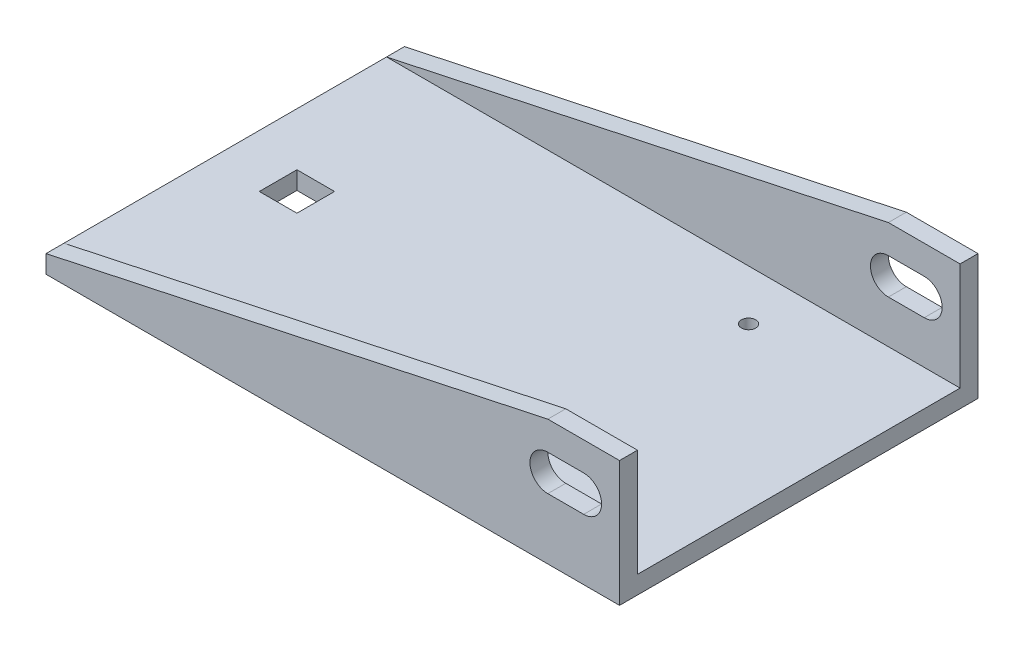
ISO-10303-21;
HEADER;
FILE_DESCRIPTION(('STEP AP214'),'2;1');
FILE_NAME('part.step','',(''),(''),'','','');
FILE_SCHEMA(('AUTOMOTIVE_DESIGN { 1 0 10303 214 1 1 1 1 }'));
ENDSEC;
DATA;
#1=APPLICATION_CONTEXT('core data for automotive mechanical design processes');
#2=APPLICATION_PROTOCOL_DEFINITION('international standard','automotive_design',2000,#1);
#3=PRODUCT_CONTEXT('',#1,'mechanical');
#4=PRODUCT('Part','Part','',(#3));
#5=PRODUCT_RELATED_PRODUCT_CATEGORY('part','',(#4));
#6=PRODUCT_DEFINITION_FORMATION('','',#4);
#7=PRODUCT_DEFINITION_CONTEXT('part definition',#1,'design');
#8=PRODUCT_DEFINITION('design','',#6,#7);
#9=PRODUCT_DEFINITION_SHAPE('','',#8);
#10=(LENGTH_UNIT() NAMED_UNIT(*) SI_UNIT(.MILLI.,.METRE.));
#11=(NAMED_UNIT(*) PLANE_ANGLE_UNIT() SI_UNIT($,.RADIAN.));
#12=(NAMED_UNIT(*) SI_UNIT($,.STERADIAN.) SOLID_ANGLE_UNIT());
#13=UNCERTAINTY_MEASURE_WITH_UNIT(LENGTH_MEASURE(1.E-05),#10,'distance_accuracy_value','');
#14=(GEOMETRIC_REPRESENTATION_CONTEXT(3) GLOBAL_UNCERTAINTY_ASSIGNED_CONTEXT((#13)) GLOBAL_UNIT_ASSIGNED_CONTEXT((#10,
#11,#12)) REPRESENTATION_CONTEXT('',''));
#15=CARTESIAN_POINT('',(0.,0.,0.));
#16=DIRECTION('',(0.,0.,1.));
#17=DIRECTION('',(1.,0.,0.));
#18=AXIS2_PLACEMENT_3D('',#15,#16,#17);
#19=CARTESIAN_POINT('',(0.,5.00000000000001,-100.));
#20=DIRECTION('',(0.209529088730874,-0.977802414077409,0.));
#21=DIRECTION('',(0.977802414077409,0.209529088730874,0.));
#22=AXIS2_PLACEMENT_3D('',#19,#20,#21);
#23=PLANE('',#22);
#24=DIRECTION('',(0.977802414077409,0.209529088730874,0.));
#25=VECTOR('',#24,1.);
#26=CARTESIAN_POINT('',(0.,5.00000000000001,-4.99999999999998));
#27=LINE('',#26,#25);
#28=CARTESIAN_POINT('',(-3.31657444563316E-13,4.99999999999995,-4.99999999999997));
#29=VERTEX_POINT('',#28);
#30=CARTESIAN_POINT('',(140.,35.,-4.99999999999996));
#31=VERTEX_POINT('',#30);
#32=EDGE_CURVE('E458',#29,#31,#27,.T.);
#33=ORIENTED_EDGE('',*,*,#32,.F.);
#34=DIRECTION('',(0.,0.,-1.));
#35=VECTOR('',#34,1.);
#36=CARTESIAN_POINT('',(0.,4.99999999999995,-50.));
#37=LINE('',#36,#35);
#38=CARTESIAN_POINT('',(0.,5.,0.));
#39=VERTEX_POINT('',#38);
#40=EDGE_CURVE('E460',#29,#39,#37,.F.);
#41=ORIENTED_EDGE('',*,*,#40,.T.);
#42=DIRECTION('',(-0.97780241407741,-0.209529088730873,0.));
#43=VECTOR('',#42,1.);
#44=CARTESIAN_POINT('',(140.,35.,0.));
#45=LINE('',#44,#43);
#46=CARTESIAN_POINT('',(140.,35.,0.));
#47=VERTEX_POINT('',#46);
#48=EDGE_CURVE('E471',#47,#39,#45,.T.);
#49=ORIENTED_EDGE('',*,*,#48,.F.);
#50=DIRECTION('',(0.,0.,1.));
#51=VECTOR('',#50,1.);
#52=CARTESIAN_POINT('',(140.,35.,-2.99999999999996));
#53=LINE('',#52,#51);
#54=EDGE_CURVE('E462',#31,#47,#53,.T.);
#55=ORIENTED_EDGE('',*,*,#54,.F.);
#56=EDGE_LOOP('',(#33,#41,#49,#55));
#57=FACE_BOUND('',#56,.T.);
#58=ADVANCED_FACE('F52',(#57),#23,.F.);
#59=CARTESIAN_POINT('',(0.,5.00000000000002,-100.));
#60=VERTEX_POINT('',#59);
#61=CARTESIAN_POINT('',(-3.3133218391157E-13,4.99999999999999,-95.));
#62=VERTEX_POINT('',#61);
#63=EDGE_CURVE('E344',#60,#62,#37,.F.);
#64=ORIENTED_EDGE('',*,*,#63,.T.);
#65=DIRECTION('',(-0.977802414077409,-0.209529088730874,0.));
#66=VECTOR('',#65,1.);
#67=CARTESIAN_POINT('',(0.,5.00000000000001,-95.));
#68=LINE('',#67,#66);
#69=CARTESIAN_POINT('',(140.,35.,-95.));
#70=VERTEX_POINT('',#69);
#71=EDGE_CURVE('E463',#70,#62,#68,.T.);
#72=ORIENTED_EDGE('',*,*,#71,.F.);
#73=DIRECTION('',(0.,0.,1.));
#74=VECTOR('',#73,1.);
#75=CARTESIAN_POINT('',(140.,35.,-100.));
#76=LINE('',#75,#74);
#77=CARTESIAN_POINT('',(140.,35.,-100.));
#78=VERTEX_POINT('',#77);
#79=EDGE_CURVE('E476',#78,#70,#76,.T.);
#80=ORIENTED_EDGE('',*,*,#79,.F.);
#81=DIRECTION('',(0.97780241407741,0.209529088730873,0.));
#82=VECTOR('',#81,1.);
#83=CARTESIAN_POINT('',(0.,5.00000000000002,-100.));
#84=LINE('',#83,#82);
#85=EDGE_CURVE('E382',#60,#78,#84,.T.);
#86=ORIENTED_EDGE('',*,*,#85,.F.);
#87=EDGE_LOOP('',(#64,#72,#80,#86));
#88=FACE_BOUND('',#87,.T.);
#89=ADVANCED_FACE('F275',(#88),#23,.F.);
#90=CARTESIAN_POINT('',(0.,33.,-95.));
#91=DIRECTION('',(0.,0.,1.));
#92=DIRECTION('',(0.,-1.,0.));
#93=AXIS2_PLACEMENT_3D('',#90,#91,#92);
#94=PLANE('',#93);
#95=ORIENTED_EDGE('',*,*,#71,.T.);
#96=DIRECTION('',(-1.,0.,0.));
#97=VECTOR('',#96,1.);
#98=CARTESIAN_POINT('',(0.,5.00000000000002,-95.));
#99=LINE('',#98,#97);
#100=CARTESIAN_POINT('',(160.,5.00000000000002,-95.));
#101=VERTEX_POINT('',#100);
#102=EDGE_CURVE('E178',#101,#62,#99,.T.);
#103=ORIENTED_EDGE('',*,*,#102,.F.);
#104=DIRECTION('',(0.,-1.,0.));
#105=VECTOR('',#104,1.);
#106=CARTESIAN_POINT('',(160.,8.12576687116561,-95.));
#107=LINE('',#106,#105);
#108=CARTESIAN_POINT('',(160.,35.,-95.));
#109=VERTEX_POINT('',#108);
#110=EDGE_CURVE('E191',#109,#101,#107,.T.);
#111=ORIENTED_EDGE('',*,*,#110,.F.);
#112=DIRECTION('',(-1.,0.,0.));
#113=VECTOR('',#112,1.);
#114=CARTESIAN_POINT('',(0.,35.,-95.));
#115=LINE('',#114,#113);
#116=EDGE_CURVE('E381',#109,#70,#115,.T.);
#117=ORIENTED_EDGE('',*,*,#116,.T.);
#118=EDGE_LOOP('',(#95,#103,#111,#117));
#119=FACE_BOUND('',#118,.T.);
#120=DIRECTION('',(1.,0.,0.));
#121=VECTOR('',#120,1.);
#122=CARTESIAN_POINT('',(150.,27.0000000000001,-95.));
#123=LINE('',#122,#121);
#124=CARTESIAN_POINT('',(140.,27.0000000000001,-95.));
#125=VERTEX_POINT('',#124);
#126=CARTESIAN_POINT('',(150.,27.0000000000001,-95.));
#127=VERTEX_POINT('',#126);
#128=EDGE_CURVE('E233',#125,#127,#123,.T.);
#129=ORIENTED_EDGE('',*,*,#128,.T.);
#130=CARTESIAN_POINT('',(150.,22.0000000000001,-95.));
#131=DIRECTION('',(0.,0.,1.));
#132=DIRECTION('',(0.,-1.,0.));
#133=AXIS2_PLACEMENT_3D('',#130,#131,#132);
#134=CIRCLE('',#133,5.);
#135=CARTESIAN_POINT('',(150.,17.0000000000001,-95.));
#136=VERTEX_POINT('',#135);
#137=EDGE_CURVE('E230',#127,#136,#134,.F.);
#138=ORIENTED_EDGE('',*,*,#137,.T.);
#139=DIRECTION('',(-1.,0.,0.));
#140=VECTOR('',#139,1.);
#141=CARTESIAN_POINT('',(150.,17.0000000000001,-95.));
#142=LINE('',#141,#140);
#143=CARTESIAN_POINT('',(140.,17.0000000000001,-95.));
#144=VERTEX_POINT('',#143);
#145=EDGE_CURVE('E227',#136,#144,#142,.T.);
#146=ORIENTED_EDGE('',*,*,#145,.T.);
#147=CARTESIAN_POINT('',(140.,22.0000000000001,-95.));
#148=DIRECTION('',(0.,0.,1.));
#149=DIRECTION('',(0.,-1.,0.));
#150=AXIS2_PLACEMENT_3D('',#147,#148,#149);
#151=CIRCLE('',#150,5.);
#152=EDGE_CURVE('E167',#144,#125,#151,.F.);
#153=ORIENTED_EDGE('',*,*,#152,.T.);
#154=EDGE_LOOP('',(#129,#138,#146,#153));
#155=FACE_BOUND('',#154,.T.);
#156=ADVANCED_FACE('F265',(#119,#155),#94,.T.);
#157=CARTESIAN_POINT('',(0.,2.99999999999995,-4.99999999999997));
#158=DIRECTION('',(0.,0.,-1.));
#159=DIRECTION('',(0.,1.,0.));
#160=AXIS2_PLACEMENT_3D('',#157,#158,#159);
#161=PLANE('',#160);
#162=DIRECTION('',(0.,1.,0.));
#163=VECTOR('',#162,1.);
#164=CARTESIAN_POINT('',(160.,8.12576687116562,-4.99999999999997));
#165=LINE('',#164,#163);
#166=CARTESIAN_POINT('',(160.,4.99999999999995,-4.99999999999997));
#167=VERTEX_POINT('',#166);
#168=CARTESIAN_POINT('',(160.,35.,-4.99999999999996));
#169=VERTEX_POINT('',#168);
#170=EDGE_CURVE('E198',#167,#169,#165,.T.);
#171=ORIENTED_EDGE('',*,*,#170,.F.);
#172=DIRECTION('',(1.,0.,0.));
#173=VECTOR('',#172,1.);
#174=CARTESIAN_POINT('',(0.,4.99999999999995,-4.99999999999997));
#175=LINE('',#174,#173);
#176=EDGE_CURVE('E174',#29,#167,#175,.T.);
#177=ORIENTED_EDGE('',*,*,#176,.F.);
#178=ORIENTED_EDGE('',*,*,#32,.T.);
#179=DIRECTION('',(-1.,0.,0.));
#180=VECTOR('',#179,1.);
#181=CARTESIAN_POINT('',(0.,35.,-4.99999999999996));
#182=LINE('',#181,#180);
#183=EDGE_CURVE('E391',#169,#31,#182,.T.);
#184=ORIENTED_EDGE('',*,*,#183,.F.);
#185=EDGE_LOOP('',(#171,#177,#178,#184));
#186=FACE_BOUND('',#185,.T.);
#187=DIRECTION('',(-1.,0.,0.));
#188=VECTOR('',#187,1.);
#189=CARTESIAN_POINT('',(140.,27.0000000000001,-4.99999999999996));
#190=LINE('',#189,#188);
#191=CARTESIAN_POINT('',(150.,27.0000000000001,-4.99999999999996));
#192=VERTEX_POINT('',#191);
#193=CARTESIAN_POINT('',(140.,27.0000000000001,-4.99999999999996));
#194=VERTEX_POINT('',#193);
#195=EDGE_CURVE('E155',#192,#194,#190,.T.);
#196=ORIENTED_EDGE('',*,*,#195,.T.);
#197=CARTESIAN_POINT('',(140.,22.0000000000001,-4.99999999999996));
#198=DIRECTION('',(0.,0.,-1.));
#199=DIRECTION('',(0.,1.,0.));
#200=AXIS2_PLACEMENT_3D('',#197,#198,#199);
#201=CIRCLE('',#200,5.);
#202=CARTESIAN_POINT('',(140.,17.0000000000001,-4.99999999999996));
#203=VERTEX_POINT('',#202);
#204=EDGE_CURVE('E158',#194,#203,#201,.F.);
#205=ORIENTED_EDGE('',*,*,#204,.T.);
#206=DIRECTION('',(1.,0.,0.));
#207=VECTOR('',#206,1.);
#208=CARTESIAN_POINT('',(140.,17.0000000000001,-4.99999999999996));
#209=LINE('',#208,#207);
#210=CARTESIAN_POINT('',(150.,17.,-4.99999999999996));
#211=VERTEX_POINT('',#210);
#212=EDGE_CURVE('E137',#203,#211,#209,.T.);
#213=ORIENTED_EDGE('',*,*,#212,.T.);
#214=CARTESIAN_POINT('',(150.,22.,-4.99999999999996));
#215=DIRECTION('',(0.,0.,-1.));
#216=DIRECTION('',(0.,1.,0.));
#217=AXIS2_PLACEMENT_3D('',#214,#215,#216);
#218=CIRCLE('',#217,5.);
#219=EDGE_CURVE('E224',#211,#192,#218,.F.);
#220=ORIENTED_EDGE('',*,*,#219,.T.);
#221=EDGE_LOOP('',(#196,#205,#213,#220));
#222=FACE_BOUND('',#221,.T.);
#223=ADVANCED_FACE('F262',(#186,#222),#161,.T.);
#224=CARTESIAN_POINT('',(0.,5.00000000000002,-97.));
#225=DIRECTION('',(0.,1.,0.));
#226=DIRECTION('',(0.,0.,1.));
#227=AXIS2_PLACEMENT_3D('',#224,#225,#226);
#228=PLANE('',#227);
#229=DIRECTION('',(-1.,0.,0.));
#230=VECTOR('',#229,1.);
#231=CARTESIAN_POINT('',(0.,4.99999999999999,-55.25));
#232=LINE('',#231,#230);
#233=CARTESIAN_POINT('',(25.25,4.99999999999999,-55.25));
#234=VERTEX_POINT('',#233);
#235=CARTESIAN_POINT('',(14.75,4.99999999999999,-55.25));
#236=VERTEX_POINT('',#235);
#237=EDGE_CURVE('E202',#234,#236,#232,.T.);
#238=ORIENTED_EDGE('',*,*,#237,.F.);
#239=DIRECTION('',(0.,0.,-1.));
#240=VECTOR('',#239,1.);
#241=CARTESIAN_POINT('',(25.25,5.00000000000002,-97.));
#242=LINE('',#241,#240);
#243=CARTESIAN_POINT('',(25.25,4.99999999999998,-44.75));
#244=VERTEX_POINT('',#243);
#245=EDGE_CURVE('E206',#244,#234,#242,.T.);
#246=ORIENTED_EDGE('',*,*,#245,.F.);
#247=DIRECTION('',(1.,0.,0.));
#248=VECTOR('',#247,1.);
#249=CARTESIAN_POINT('',(0.,4.99999999999998,-44.75));
#250=LINE('',#249,#248);
#251=CARTESIAN_POINT('',(14.75,4.99999999999998,-44.75));
#252=VERTEX_POINT('',#251);
#253=EDGE_CURVE('E71',#252,#244,#250,.T.);
#254=ORIENTED_EDGE('',*,*,#253,.F.);
#255=DIRECTION('',(0.,0.,1.));
#256=VECTOR('',#255,1.);
#257=CARTESIAN_POINT('',(14.75,5.00000000000002,-97.));
#258=LINE('',#257,#256);
#259=EDGE_CURVE('E205',#236,#252,#258,.T.);
#260=ORIENTED_EDGE('',*,*,#259,.F.);
#261=EDGE_LOOP('',(#238,#246,#254,#260));
#262=FACE_BOUND('',#261,.T.);
#263=DIRECTION('',(0.,0.,1.));
#264=VECTOR('',#263,1.);
#265=CARTESIAN_POINT('',(160.,4.99999999999999,-50.));
#266=LINE('',#265,#264);
#267=EDGE_CURVE('E194',#101,#167,#266,.T.);
#268=ORIENTED_EDGE('',*,*,#267,.F.);
#269=ORIENTED_EDGE('',*,*,#102,.T.);
#270=DIRECTION('',(0.,0.,1.));
#271=VECTOR('',#270,1.);
#272=CARTESIAN_POINT('',(-3.31657444563316E-13,5.,-104.545214042184));
#273=LINE('',#272,#271);
#274=EDGE_CURVE('E465',#62,#29,#273,.T.);
#275=ORIENTED_EDGE('',*,*,#274,.T.);
#276=ORIENTED_EDGE('',*,*,#176,.T.);
#277=EDGE_LOOP('',(#268,#269,#275,#276));
#278=FACE_BOUND('',#277,.T.);
#279=CARTESIAN_POINT('',(115.,5.00000000000002,-81.));
#280=DIRECTION('',(0.,1.,0.));
#281=DIRECTION('',(0.,0.,1.));
#282=AXIS2_PLACEMENT_3D('',#279,#280,#281);
#283=CIRCLE('',#282,2.);
#284=CARTESIAN_POINT('',(115.,5.00000000000002,-79.));
#285=VERTEX_POINT('',#284);
#286=EDGE_CURVE('E169',#285,#285,#283,.T.);
#287=ORIENTED_EDGE('',*,*,#286,.F.);
#288=EDGE_LOOP('',(#287));
#289=FACE_BOUND('',#288,.T.);
#290=CARTESIAN_POINT('',(115.,4.99999999999996,-19.));
#291=DIRECTION('',(0.,1.,0.));
#292=DIRECTION('',(0.,0.,1.));
#293=AXIS2_PLACEMENT_3D('',#290,#291,#292);
#294=CIRCLE('',#293,2.);
#295=CARTESIAN_POINT('',(115.,4.99999999999996,-17.));
#296=VERTEX_POINT('',#295);
#297=EDGE_CURVE('E163',#296,#296,#294,.T.);
#298=ORIENTED_EDGE('',*,*,#297,.F.);
#299=EDGE_LOOP('',(#298));
#300=FACE_BOUND('',#299,.T.);
#301=ADVANCED_FACE('F264',(#262,#278,#289,#300),#228,.T.);
#302=CARTESIAN_POINT('',(0.,8.12576687116564,-50.));
#303=DIRECTION('',(1.,0.,0.));
#304=DIRECTION('',(0.,0.,-1.));
#305=AXIS2_PLACEMENT_3D('',#302,#303,#304);
#306=PLANE('',#305);
#307=DIRECTION('',(0.,1.,0.));
#308=VECTOR('',#307,1.);
#309=CARTESIAN_POINT('',(0.,0.,-100.));
#310=LINE('',#309,#308);
#311=CARTESIAN_POINT('',(0.,0.,-100.));
#312=VERTEX_POINT('',#311);
#313=EDGE_CURVE('E187',#312,#60,#310,.T.);
#314=ORIENTED_EDGE('',*,*,#313,.F.);
#315=DIRECTION('',(0.,0.,-1.));
#316=VECTOR('',#315,1.);
#317=CARTESIAN_POINT('',(0.,0.,0.));
#318=LINE('',#317,#316);
#319=CARTESIAN_POINT('',(0.,0.,0.));
#320=VERTEX_POINT('',#319);
#321=EDGE_CURVE('E339',#320,#312,#318,.T.);
#322=ORIENTED_EDGE('',*,*,#321,.F.);
#323=DIRECTION('',(0.,-1.,0.));
#324=VECTOR('',#323,1.);
#325=CARTESIAN_POINT('',(0.,33.,0.));
#326=LINE('',#325,#324);
#327=EDGE_CURVE('E201',#39,#320,#326,.T.);
#328=ORIENTED_EDGE('',*,*,#327,.F.);
#329=ORIENTED_EDGE('',*,*,#40,.F.);
#330=ORIENTED_EDGE('',*,*,#274,.F.);
#331=ORIENTED_EDGE('',*,*,#63,.F.);
#332=EDGE_LOOP('',(#314,#322,#328,#329,#330,#331));
#333=FACE_BOUND('',#332,.T.);
#334=ADVANCED_FACE('F272',(#333),#306,.F.);
#335=CARTESIAN_POINT('',(0.,0.,-100.));
#336=DIRECTION('',(0.,0.,-1.));
#337=DIRECTION('',(-1.,0.,0.));
#338=AXIS2_PLACEMENT_3D('',#335,#336,#337);
#339=PLANE('',#338);
#340=DIRECTION('',(1.,0.,0.));
#341=VECTOR('',#340,1.);
#342=CARTESIAN_POINT('',(0.,0.,-100.));
#343=LINE('',#342,#341);
#344=CARTESIAN_POINT('',(160.,0.,-100.));
#345=VERTEX_POINT('',#344);
#346=EDGE_CURVE('E351',#312,#345,#343,.T.);
#347=ORIENTED_EDGE('',*,*,#346,.F.);
#348=ORIENTED_EDGE('',*,*,#313,.T.);
#349=ORIENTED_EDGE('',*,*,#85,.T.);
#350=DIRECTION('',(-1.,0.,0.));
#351=VECTOR('',#350,1.);
#352=CARTESIAN_POINT('',(0.,35.,-100.));
#353=LINE('',#352,#351);
#354=CARTESIAN_POINT('',(160.,35.,-100.));
#355=VERTEX_POINT('',#354);
#356=EDGE_CURVE('E379',#78,#355,#353,.F.);
#357=ORIENTED_EDGE('',*,*,#356,.T.);
#358=DIRECTION('',(0.,1.,0.));
#359=VECTOR('',#358,1.);
#360=CARTESIAN_POINT('',(160.,8.12576687116564,-100.));
#361=LINE('',#360,#359);
#362=EDGE_CURVE('E195',#345,#355,#361,.T.);
#363=ORIENTED_EDGE('',*,*,#362,.F.);
#364=EDGE_LOOP('',(#347,#348,#349,#357,#363));
#365=FACE_BOUND('',#364,.T.);
#366=CARTESIAN_POINT('',(150.,22.0000000000001,-100.));
#367=DIRECTION('',(0.,0.,-1.));
#368=DIRECTION('',(-1.,0.,0.));
#369=AXIS2_PLACEMENT_3D('',#366,#367,#368);
#370=CIRCLE('',#369,5.);
#371=CARTESIAN_POINT('',(150.,27.0000000000001,-100.));
#372=VERTEX_POINT('',#371);
#373=CARTESIAN_POINT('',(150.,17.0000000000001,-100.));
#374=VERTEX_POINT('',#373);
#375=EDGE_CURVE('E223',#372,#374,#370,.T.);
#376=ORIENTED_EDGE('',*,*,#375,.F.);
#377=DIRECTION('',(1.,0.,0.));
#378=VECTOR('',#377,1.);
#379=CARTESIAN_POINT('',(150.,27.0000000000001,-100.));
#380=LINE('',#379,#378);
#381=CARTESIAN_POINT('',(140.,27.0000000000001,-100.));
#382=VERTEX_POINT('',#381);
#383=EDGE_CURVE('E220',#382,#372,#380,.T.);
#384=ORIENTED_EDGE('',*,*,#383,.F.);
#385=CARTESIAN_POINT('',(140.,22.0000000000001,-100.));
#386=DIRECTION('',(0.,0.,-1.));
#387=DIRECTION('',(-1.,0.,0.));
#388=AXIS2_PLACEMENT_3D('',#385,#386,#387);
#389=CIRCLE('',#388,5.);
#390=CARTESIAN_POINT('',(140.,17.0000000000001,-100.));
#391=VERTEX_POINT('',#390);
#392=EDGE_CURVE('E217',#391,#382,#389,.T.);
#393=ORIENTED_EDGE('',*,*,#392,.F.);
#394=DIRECTION('',(-1.,0.,0.));
#395=VECTOR('',#394,1.);
#396=CARTESIAN_POINT('',(150.,17.0000000000001,-100.));
#397=LINE('',#396,#395);
#398=EDGE_CURVE('E216',#374,#391,#397,.T.);
#399=ORIENTED_EDGE('',*,*,#398,.F.);
#400=EDGE_LOOP('',(#376,#384,#393,#399));
#401=FACE_BOUND('',#400,.T.);
#402=ADVANCED_FACE('F321',(#365,#401),#339,.T.);
#403=CARTESIAN_POINT('',(160.,8.12576687116564,-50.));
#404=DIRECTION('',(1.,0.,0.));
#405=DIRECTION('',(0.,0.,-1.));
#406=AXIS2_PLACEMENT_3D('',#403,#404,#405);
#407=PLANE('',#406);
#408=ORIENTED_EDGE('',*,*,#170,.T.);
#409=DIRECTION('',(0.,0.,-1.));
#410=VECTOR('',#409,1.);
#411=CARTESIAN_POINT('',(160.,35.,-50.));
#412=LINE('',#411,#410);
#413=CARTESIAN_POINT('',(160.,35.,0.));
#414=VERTEX_POINT('',#413);
#415=EDGE_CURVE('E385',#169,#414,#412,.F.);
#416=ORIENTED_EDGE('',*,*,#415,.T.);
#417=DIRECTION('',(0.,-1.,0.));
#418=VECTOR('',#417,1.);
#419=CARTESIAN_POINT('',(160.,33.,0.));
#420=LINE('',#419,#418);
#421=CARTESIAN_POINT('',(160.,0.,0.));
#422=VERTEX_POINT('',#421);
#423=EDGE_CURVE('E360',#422,#414,#420,.F.);
#424=ORIENTED_EDGE('',*,*,#423,.F.);
#425=DIRECTION('',(0.,0.,-1.));
#426=VECTOR('',#425,1.);
#427=CARTESIAN_POINT('',(160.,0.,0.));
#428=LINE('',#427,#426);
#429=EDGE_CURVE('E62',#345,#422,#428,.F.);
#430=ORIENTED_EDGE('',*,*,#429,.F.);
#431=ORIENTED_EDGE('',*,*,#362,.T.);
#432=DIRECTION('',(0.,0.,-1.));
#433=VECTOR('',#432,1.);
#434=CARTESIAN_POINT('',(160.,35.,-50.));
#435=LINE('',#434,#433);
#436=EDGE_CURVE('E371',#355,#109,#435,.F.);
#437=ORIENTED_EDGE('',*,*,#436,.T.);
#438=ORIENTED_EDGE('',*,*,#110,.T.);
#439=ORIENTED_EDGE('',*,*,#267,.T.);
#440=EDGE_LOOP('',(#408,#416,#424,#430,#431,#437,#438,#439));
#441=FACE_BOUND('',#440,.T.);
#442=ADVANCED_FACE('F317',(#441),#407,.T.);
#443=CARTESIAN_POINT('',(0.,33.,0.));
#444=DIRECTION('',(0.,0.,1.));
#445=DIRECTION('',(0.,-1.,0.));
#446=AXIS2_PLACEMENT_3D('',#443,#444,#445);
#447=PLANE('',#446);
#448=ORIENTED_EDGE('',*,*,#48,.T.);
#449=ORIENTED_EDGE('',*,*,#327,.T.);
#450=DIRECTION('',(1.,0.,0.));
#451=VECTOR('',#450,1.);
#452=CARTESIAN_POINT('',(0.,0.,0.));
#453=LINE('',#452,#451);
#454=EDGE_CURVE('E14',#422,#320,#453,.F.);
#455=ORIENTED_EDGE('',*,*,#454,.F.);
#456=ORIENTED_EDGE('',*,*,#423,.T.);
#457=DIRECTION('',(1.,0.,0.));
#458=VECTOR('',#457,1.);
#459=CARTESIAN_POINT('',(0.,35.,0.));
#460=LINE('',#459,#458);
#461=EDGE_CURVE('E213',#414,#47,#460,.F.);
#462=ORIENTED_EDGE('',*,*,#461,.T.);
#463=EDGE_LOOP('',(#448,#449,#455,#456,#462));
#464=FACE_BOUND('',#463,.T.);
#465=CARTESIAN_POINT('',(140.,22.0000000000001,0.));
#466=DIRECTION('',(0.,0.,1.));
#467=DIRECTION('',(1.,0.,0.));
#468=AXIS2_PLACEMENT_3D('',#465,#466,#467);
#469=CIRCLE('',#468,5.);
#470=CARTESIAN_POINT('',(140.,27.0000000000001,0.));
#471=VERTEX_POINT('',#470);
#472=CARTESIAN_POINT('',(140.,17.0000000000001,0.));
#473=VERTEX_POINT('',#472);
#474=EDGE_CURVE('E144',#471,#473,#469,.T.);
#475=ORIENTED_EDGE('',*,*,#474,.F.);
#476=DIRECTION('',(-1.,0.,0.));
#477=VECTOR('',#476,1.);
#478=CARTESIAN_POINT('',(140.,27.0000000000001,0.));
#479=LINE('',#478,#477);
#480=CARTESIAN_POINT('',(150.,27.0000000000001,0.));
#481=VERTEX_POINT('',#480);
#482=EDGE_CURVE('E247',#481,#471,#479,.T.);
#483=ORIENTED_EDGE('',*,*,#482,.F.);
#484=CARTESIAN_POINT('',(150.,22.,0.));
#485=DIRECTION('',(0.,0.,1.));
#486=DIRECTION('',(1.,0.,0.));
#487=AXIS2_PLACEMENT_3D('',#484,#485,#486);
#488=CIRCLE('',#487,5.);
#489=CARTESIAN_POINT('',(150.,17.,0.));
#490=VERTEX_POINT('',#489);
#491=EDGE_CURVE('E140',#490,#481,#488,.T.);
#492=ORIENTED_EDGE('',*,*,#491,.F.);
#493=DIRECTION('',(1.,0.,0.));
#494=VECTOR('',#493,1.);
#495=CARTESIAN_POINT('',(140.,17.0000000000001,0.));
#496=LINE('',#495,#494);
#497=EDGE_CURVE('E134',#473,#490,#496,.T.);
#498=ORIENTED_EDGE('',*,*,#497,.F.);
#499=EDGE_LOOP('',(#475,#483,#492,#498));
#500=FACE_BOUND('',#499,.T.);
#501=ADVANCED_FACE('F153',(#464,#500),#447,.T.);
#502=CARTESIAN_POINT('',(0.,0.,0.));
#503=DIRECTION('',(0.,-1.,0.));
#504=DIRECTION('',(0.,0.,-1.));
#505=AXIS2_PLACEMENT_3D('',#502,#503,#504);
#506=PLANE('',#505);
#507=DIRECTION('',(-1.,0.,0.));
#508=VECTOR('',#507,1.);
#509=CARTESIAN_POINT('',(14.75,0.,-55.25));
#510=LINE('',#509,#508);
#511=CARTESIAN_POINT('',(25.25,0.,-55.25));
#512=VERTEX_POINT('',#511);
#513=CARTESIAN_POINT('',(14.75,0.,-55.25));
#514=VERTEX_POINT('',#513);
#515=EDGE_CURVE('E210',#512,#514,#510,.T.);
#516=ORIENTED_EDGE('',*,*,#515,.T.);
#517=DIRECTION('',(0.,0.,1.));
#518=VECTOR('',#517,1.);
#519=CARTESIAN_POINT('',(14.75,0.,-44.75));
#520=LINE('',#519,#518);
#521=CARTESIAN_POINT('',(14.75,0.,-44.75));
#522=VERTEX_POINT('',#521);
#523=EDGE_CURVE('E407',#514,#522,#520,.T.);
#524=ORIENTED_EDGE('',*,*,#523,.T.);
#525=DIRECTION('',(1.,0.,0.));
#526=VECTOR('',#525,1.);
#527=CARTESIAN_POINT('',(14.75,0.,-44.75));
#528=LINE('',#527,#526);
#529=CARTESIAN_POINT('',(25.25,0.,-44.75));
#530=VERTEX_POINT('',#529);
#531=EDGE_CURVE('E403',#522,#530,#528,.T.);
#532=ORIENTED_EDGE('',*,*,#531,.T.);
#533=DIRECTION('',(0.,0.,-1.));
#534=VECTOR('',#533,1.);
#535=CARTESIAN_POINT('',(25.25,0.,-44.75));
#536=LINE('',#535,#534);
#537=EDGE_CURVE('E399',#530,#512,#536,.T.);
#538=ORIENTED_EDGE('',*,*,#537,.T.);
#539=EDGE_LOOP('',(#516,#524,#532,#538));
#540=FACE_BOUND('',#539,.T.);
#541=ORIENTED_EDGE('',*,*,#429,.T.);
#542=ORIENTED_EDGE('',*,*,#454,.T.);
#543=ORIENTED_EDGE('',*,*,#321,.T.);
#544=ORIENTED_EDGE('',*,*,#346,.T.);
#545=EDGE_LOOP('',(#541,#542,#543,#544));
#546=FACE_BOUND('',#545,.T.);
#547=CARTESIAN_POINT('',(115.,0.,-81.));
#548=DIRECTION('',(0.,-1.,0.));
#549=DIRECTION('',(0.,0.,-1.));
#550=AXIS2_PLACEMENT_3D('',#547,#548,#549);
#551=CIRCLE('',#550,2.);
#552=CARTESIAN_POINT('',(115.,0.,-83.));
#553=VERTEX_POINT('',#552);
#554=EDGE_CURVE('E56',#553,#553,#551,.F.);
#555=ORIENTED_EDGE('',*,*,#554,.T.);
#556=EDGE_LOOP('',(#555));
#557=FACE_BOUND('',#556,.T.);
#558=CARTESIAN_POINT('',(115.,0.,-19.));
#559=DIRECTION('',(0.,-1.,0.));
#560=DIRECTION('',(0.,0.,-1.));
#561=AXIS2_PLACEMENT_3D('',#558,#559,#560);
#562=CIRCLE('',#561,2.);
#563=CARTESIAN_POINT('',(115.,0.,-21.));
#564=VERTEX_POINT('',#563);
#565=EDGE_CURVE('E166',#564,#564,#562,.F.);
#566=ORIENTED_EDGE('',*,*,#565,.T.);
#567=EDGE_LOOP('',(#566));
#568=FACE_BOUND('',#567,.T.);
#569=ADVANCED_FACE('F286',(#540,#546,#557,#568),#506,.T.);
#570=CARTESIAN_POINT('',(115.,-15.556349186104,-81.));
#571=DIRECTION('',(0.,1.,0.));
#572=DIRECTION('',(0.,0.,1.));
#573=AXIS2_PLACEMENT_3D('',#570,#571,#572);
#574=CYLINDRICAL_SURFACE('',#573,2.);
#575=ORIENTED_EDGE('',*,*,#286,.T.);
#576=EDGE_LOOP('',(#575));
#577=FACE_BOUND('',#576,.T.);
#578=ORIENTED_EDGE('',*,*,#554,.F.);
#579=EDGE_LOOP('',(#578));
#580=FACE_BOUND('',#579,.T.);
#581=ADVANCED_FACE('F54',(#577,#580),#574,.F.);
#582=CARTESIAN_POINT('',(115.,-15.5563491861041,-19.));
#583=DIRECTION('',(0.,1.,0.));
#584=DIRECTION('',(0.,0.,1.));
#585=AXIS2_PLACEMENT_3D('',#582,#583,#584);
#586=CYLINDRICAL_SURFACE('',#585,2.);
#587=ORIENTED_EDGE('',*,*,#297,.T.);
#588=EDGE_LOOP('',(#587));
#589=FACE_BOUND('',#588,.T.);
#590=ORIENTED_EDGE('',*,*,#565,.F.);
#591=EDGE_LOOP('',(#590));
#592=FACE_BOUND('',#591,.T.);
#593=ADVANCED_FACE('F503',(#589,#592),#586,.F.);
#594=CARTESIAN_POINT('',(150.,22.0000000000001,-73.967414387438));
#595=DIRECTION('',(0.,0.,-1.));
#596=DIRECTION('',(-1.,0.,0.));
#597=AXIS2_PLACEMENT_3D('',#594,#595,#596);
#598=CYLINDRICAL_SURFACE('',#597,5.);
#599=ORIENTED_EDGE('',*,*,#137,.F.);
#600=DIRECTION('',(0.,0.,-1.));
#601=VECTOR('',#600,1.);
#602=CARTESIAN_POINT('',(150.,27.0000000000001,-73.967414387438));
#603=LINE('',#602,#601);
#604=EDGE_CURVE('E221',#127,#372,#603,.T.);
#605=ORIENTED_EDGE('',*,*,#604,.T.);
#606=ORIENTED_EDGE('',*,*,#375,.T.);
#607=DIRECTION('',(0.,0.,-1.));
#608=VECTOR('',#607,1.);
#609=CARTESIAN_POINT('',(150.,17.0000000000001,-73.967414387438));
#610=LINE('',#609,#608);
#611=EDGE_CURVE('E214',#136,#374,#610,.T.);
#612=ORIENTED_EDGE('',*,*,#611,.F.);
#613=EDGE_LOOP('',(#599,#605,#606,#612));
#614=FACE_BOUND('',#613,.T.);
#615=ADVANCED_FACE('F490',(#614),#598,.F.);
#616=CARTESIAN_POINT('',(150.,27.0000000000001,-73.967414387438));
#617=DIRECTION('',(0.,1.,0.));
#618=DIRECTION('',(0.,0.,1.));
#619=AXIS2_PLACEMENT_3D('',#616,#617,#618);
#620=PLANE('',#619);
#621=ORIENTED_EDGE('',*,*,#128,.F.);
#622=DIRECTION('',(0.,0.,-1.));
#623=VECTOR('',#622,1.);
#624=CARTESIAN_POINT('',(140.,27.0000000000001,-73.967414387438));
#625=LINE('',#624,#623);
#626=EDGE_CURVE('E225',#125,#382,#625,.T.);
#627=ORIENTED_EDGE('',*,*,#626,.T.);
#628=ORIENTED_EDGE('',*,*,#383,.T.);
#629=ORIENTED_EDGE('',*,*,#604,.F.);
#630=EDGE_LOOP('',(#621,#627,#628,#629));
#631=FACE_BOUND('',#630,.T.);
#632=ADVANCED_FACE('F482',(#631),#620,.F.);
#633=CARTESIAN_POINT('',(140.,22.0000000000001,-73.967414387438));
#634=DIRECTION('',(0.,0.,-1.));
#635=DIRECTION('',(-1.,0.,0.));
#636=AXIS2_PLACEMENT_3D('',#633,#634,#635);
#637=CYLINDRICAL_SURFACE('',#636,5.);
#638=ORIENTED_EDGE('',*,*,#152,.F.);
#639=DIRECTION('',(0.,0.,-1.));
#640=VECTOR('',#639,1.);
#641=CARTESIAN_POINT('',(140.,17.0000000000001,-73.967414387438));
#642=LINE('',#641,#640);
#643=EDGE_CURVE('E218',#144,#391,#642,.T.);
#644=ORIENTED_EDGE('',*,*,#643,.T.);
#645=ORIENTED_EDGE('',*,*,#392,.T.);
#646=ORIENTED_EDGE('',*,*,#626,.F.);
#647=EDGE_LOOP('',(#638,#644,#645,#646));
#648=FACE_BOUND('',#647,.T.);
#649=ADVANCED_FACE('F484',(#648),#637,.F.);
#650=CARTESIAN_POINT('',(150.,17.0000000000001,-73.967414387438));
#651=DIRECTION('',(0.,-1.,0.));
#652=DIRECTION('',(0.,0.,-1.));
#653=AXIS2_PLACEMENT_3D('',#650,#651,#652);
#654=PLANE('',#653);
#655=ORIENTED_EDGE('',*,*,#145,.F.);
#656=ORIENTED_EDGE('',*,*,#611,.T.);
#657=ORIENTED_EDGE('',*,*,#398,.T.);
#658=ORIENTED_EDGE('',*,*,#643,.F.);
#659=EDGE_LOOP('',(#655,#656,#657,#658));
#660=FACE_BOUND('',#659,.T.);
#661=ADVANCED_FACE('F493',(#660),#654,.F.);
#662=CARTESIAN_POINT('',(140.,22.0000000000001,-26.0325856125617));
#663=DIRECTION('',(0.,0.,1.));
#664=DIRECTION('',(1.,0.,0.));
#665=AXIS2_PLACEMENT_3D('',#662,#663,#664);
#666=CYLINDRICAL_SURFACE('',#665,5.);
#667=ORIENTED_EDGE('',*,*,#204,.F.);
#668=DIRECTION('',(0.,0.,1.));
#669=VECTOR('',#668,1.);
#670=CARTESIAN_POINT('',(140.,27.0000000000001,-26.0325856125617));
#671=LINE('',#670,#669);
#672=EDGE_CURVE('E147',#194,#471,#671,.T.);
#673=ORIENTED_EDGE('',*,*,#672,.T.);
#674=ORIENTED_EDGE('',*,*,#474,.T.);
#675=DIRECTION('',(0.,0.,1.));
#676=VECTOR('',#675,1.);
#677=CARTESIAN_POINT('',(140.,17.0000000000001,-26.0325856125617));
#678=LINE('',#677,#676);
#679=EDGE_CURVE('E130',#203,#473,#678,.T.);
#680=ORIENTED_EDGE('',*,*,#679,.F.);
#681=EDGE_LOOP('',(#667,#673,#674,#680));
#682=FACE_BOUND('',#681,.T.);
#683=ADVANCED_FACE('F145',(#682),#666,.F.);
#684=CARTESIAN_POINT('',(140.,27.0000000000001,-26.0325856125617));
#685=DIRECTION('',(0.,1.,0.));
#686=DIRECTION('',(0.,0.,1.));
#687=AXIS2_PLACEMENT_3D('',#684,#685,#686);
#688=PLANE('',#687);
#689=ORIENTED_EDGE('',*,*,#195,.F.);
#690=DIRECTION('',(0.,0.,1.));
#691=VECTOR('',#690,1.);
#692=CARTESIAN_POINT('',(150.,27.0000000000001,-26.0325856125617));
#693=LINE('',#692,#691);
#694=EDGE_CURVE('E151',#192,#481,#693,.T.);
#695=ORIENTED_EDGE('',*,*,#694,.T.);
#696=ORIENTED_EDGE('',*,*,#482,.T.);
#697=ORIENTED_EDGE('',*,*,#672,.F.);
#698=EDGE_LOOP('',(#689,#695,#696,#697));
#699=FACE_BOUND('',#698,.T.);
#700=ADVANCED_FACE('F256',(#699),#688,.F.);
#701=CARTESIAN_POINT('',(150.,22.,-26.0325856125617));
#702=DIRECTION('',(0.,0.,1.));
#703=DIRECTION('',(1.,0.,0.));
#704=AXIS2_PLACEMENT_3D('',#701,#702,#703);
#705=CYLINDRICAL_SURFACE('',#704,5.);
#706=ORIENTED_EDGE('',*,*,#219,.F.);
#707=DIRECTION('',(0.,0.,1.));
#708=VECTOR('',#707,1.);
#709=CARTESIAN_POINT('',(150.,17.,-26.0325856125617));
#710=LINE('',#709,#708);
#711=EDGE_CURVE('E250',#211,#490,#710,.T.);
#712=ORIENTED_EDGE('',*,*,#711,.T.);
#713=ORIENTED_EDGE('',*,*,#491,.T.);
#714=ORIENTED_EDGE('',*,*,#694,.F.);
#715=EDGE_LOOP('',(#706,#712,#713,#714));
#716=FACE_BOUND('',#715,.T.);
#717=ADVANCED_FACE('F260',(#716),#705,.F.);
#718=CARTESIAN_POINT('',(140.,17.0000000000001,-26.0325856125617));
#719=DIRECTION('',(0.,-1.,0.));
#720=DIRECTION('',(0.,0.,-1.));
#721=AXIS2_PLACEMENT_3D('',#718,#719,#720);
#722=PLANE('',#721);
#723=ORIENTED_EDGE('',*,*,#212,.F.);
#724=ORIENTED_EDGE('',*,*,#679,.T.);
#725=ORIENTED_EDGE('',*,*,#497,.T.);
#726=ORIENTED_EDGE('',*,*,#711,.F.);
#727=EDGE_LOOP('',(#723,#724,#725,#726));
#728=FACE_BOUND('',#727,.T.);
#729=ADVANCED_FACE('F132',(#728),#722,.F.);
#730=CARTESIAN_POINT('',(14.75,-14.8492424049175,-55.25));
#731=DIRECTION('',(0.,0.,-1.));
#732=DIRECTION('',(0.,1.,0.));
#733=AXIS2_PLACEMENT_3D('',#730,#731,#732);
#734=PLANE('',#733);
#735=DIRECTION('',(0.,1.,0.));
#736=VECTOR('',#735,1.);
#737=CARTESIAN_POINT('',(25.25,-14.8492424049175,-55.25));
#738=LINE('',#737,#736);
#739=EDGE_CURVE('E249',#512,#234,#738,.T.);
#740=ORIENTED_EDGE('',*,*,#739,.T.);
#741=ORIENTED_EDGE('',*,*,#237,.T.);
#742=DIRECTION('',(0.,1.,0.));
#743=VECTOR('',#742,1.);
#744=CARTESIAN_POINT('',(14.75,-14.8492424049175,-55.25));
#745=LINE('',#744,#743);
#746=EDGE_CURVE('E398',#514,#236,#745,.T.);
#747=ORIENTED_EDGE('',*,*,#746,.F.);
#748=ORIENTED_EDGE('',*,*,#515,.F.);
#749=EDGE_LOOP('',(#740,#741,#747,#748));
#750=FACE_BOUND('',#749,.T.);
#751=ADVANCED_FACE('F307',(#750),#734,.F.);
#752=CARTESIAN_POINT('',(14.75,-14.8492424049175,-44.75));
#753=DIRECTION('',(-1.,0.,0.));
#754=DIRECTION('',(0.,0.,1.));
#755=AXIS2_PLACEMENT_3D('',#752,#753,#754);
#756=PLANE('',#755);
#757=ORIENTED_EDGE('',*,*,#746,.T.);
#758=ORIENTED_EDGE('',*,*,#259,.T.);
#759=DIRECTION('',(0.,1.,0.));
#760=VECTOR('',#759,1.);
#761=CARTESIAN_POINT('',(14.75,-14.8492424049175,-44.75));
#762=LINE('',#761,#760);
#763=EDGE_CURVE('E406',#522,#252,#762,.T.);
#764=ORIENTED_EDGE('',*,*,#763,.F.);
#765=ORIENTED_EDGE('',*,*,#523,.F.);
#766=EDGE_LOOP('',(#757,#758,#764,#765));
#767=FACE_BOUND('',#766,.T.);
#768=ADVANCED_FACE('F304',(#767),#756,.F.);
#769=CARTESIAN_POINT('',(14.75,-14.8492424049175,-44.75));
#770=DIRECTION('',(0.,0.,1.));
#771=DIRECTION('',(0.,-1.,0.));
#772=AXIS2_PLACEMENT_3D('',#769,#770,#771);
#773=PLANE('',#772);
#774=ORIENTED_EDGE('',*,*,#763,.T.);
#775=ORIENTED_EDGE('',*,*,#253,.T.);
#776=DIRECTION('',(0.,1.,0.));
#777=VECTOR('',#776,1.);
#778=CARTESIAN_POINT('',(25.25,-14.8492424049175,-44.75));
#779=LINE('',#778,#777);
#780=EDGE_CURVE('E402',#530,#244,#779,.T.);
#781=ORIENTED_EDGE('',*,*,#780,.F.);
#782=ORIENTED_EDGE('',*,*,#531,.F.);
#783=EDGE_LOOP('',(#774,#775,#781,#782));
#784=FACE_BOUND('',#783,.T.);
#785=ADVANCED_FACE('F300',(#784),#773,.F.);
#786=CARTESIAN_POINT('',(25.25,-14.8492424049175,-44.75));
#787=DIRECTION('',(1.,0.,0.));
#788=DIRECTION('',(0.,0.,-1.));
#789=AXIS2_PLACEMENT_3D('',#786,#787,#788);
#790=PLANE('',#789);
#791=ORIENTED_EDGE('',*,*,#780,.T.);
#792=ORIENTED_EDGE('',*,*,#245,.T.);
#793=ORIENTED_EDGE('',*,*,#739,.F.);
#794=ORIENTED_EDGE('',*,*,#537,.F.);
#795=EDGE_LOOP('',(#791,#792,#793,#794));
#796=FACE_BOUND('',#795,.T.);
#797=ADVANCED_FACE('F296',(#796),#790,.F.);
#798=CARTESIAN_POINT('',(0.,35.,-2.99999999999996));
#799=DIRECTION('',(0.,1.,0.));
#800=DIRECTION('',(0.,0.,1.));
#801=AXIS2_PLACEMENT_3D('',#798,#799,#800);
#802=PLANE('',#801);
#803=ORIENTED_EDGE('',*,*,#415,.F.);
#804=ORIENTED_EDGE('',*,*,#183,.T.);
#805=ORIENTED_EDGE('',*,*,#54,.T.);
#806=ORIENTED_EDGE('',*,*,#461,.F.);
#807=EDGE_LOOP('',(#803,#804,#805,#806));
#808=FACE_BOUND('',#807,.T.);
#809=ADVANCED_FACE('F292',(#808),#802,.T.);
#810=CARTESIAN_POINT('',(0.,35.,-100.));
#811=DIRECTION('',(0.,1.,0.));
#812=DIRECTION('',(0.,0.,1.));
#813=AXIS2_PLACEMENT_3D('',#810,#811,#812);
#814=PLANE('',#813);
#815=ORIENTED_EDGE('',*,*,#436,.F.);
#816=ORIENTED_EDGE('',*,*,#356,.F.);
#817=ORIENTED_EDGE('',*,*,#79,.T.);
#818=ORIENTED_EDGE('',*,*,#116,.F.);
#819=EDGE_LOOP('',(#815,#816,#817,#818));
#820=FACE_BOUND('',#819,.T.);
#821=ADVANCED_FACE('F289',(#820),#814,.T.);
#822=CLOSED_SHELL('',(#58,#89,#156,#223,#301,#334,#402,#442,#501,#569,#581,#593,#615,#632,#649,
#661,#683,#700,#717,#729,#751,#768,#785,#797,#809,#821));
#823=MANIFOLD_SOLID_BREP('B2',#822);
#824=ADVANCED_BREP_SHAPE_REPRESENTATION('',(#18,#823),#14);
#825=SHAPE_DEFINITION_REPRESENTATION(#9,#824);
ENDSEC;
END-ISO-10303-21;
